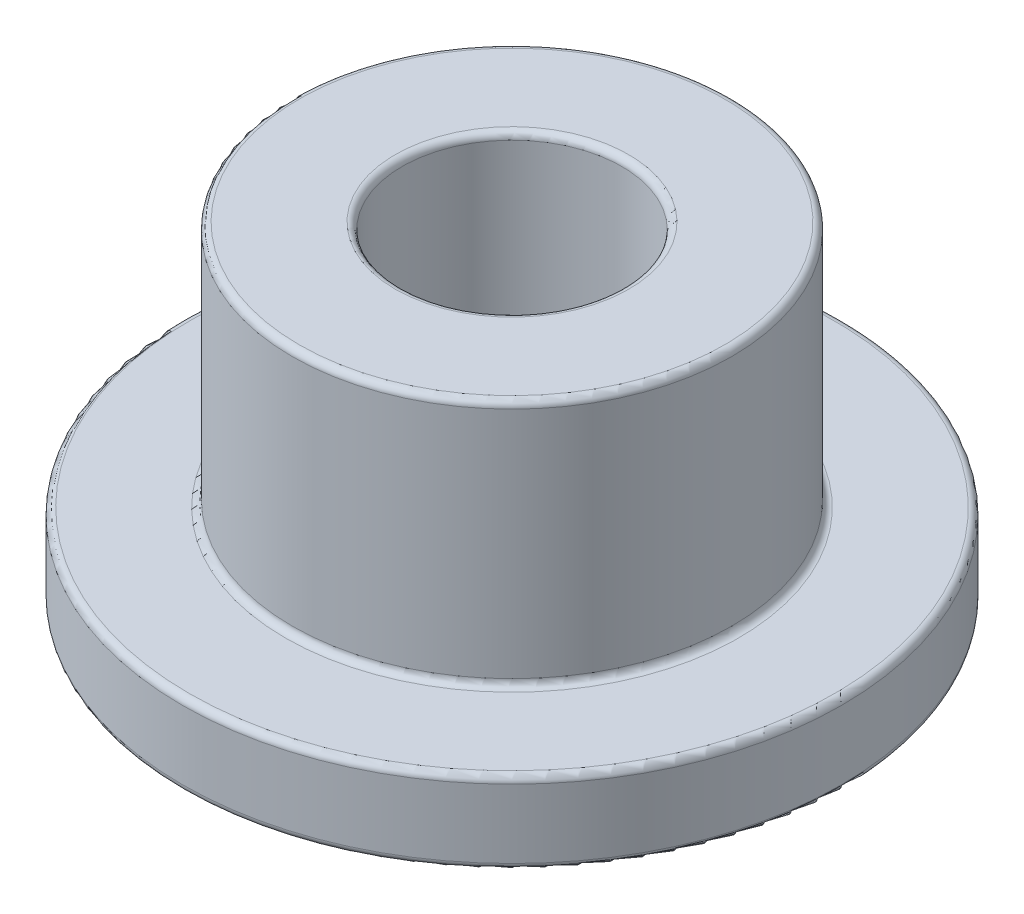
ISO-10303-21;
HEADER;
FILE_DESCRIPTION(('STEP AP214'),'2;1');
FILE_NAME('part.step','',(''),(''),'','','');
FILE_SCHEMA(('AUTOMOTIVE_DESIGN { 1 0 10303 214 1 1 1 1 }'));
ENDSEC;
DATA;
#1=APPLICATION_CONTEXT('core data for automotive mechanical design processes');
#2=APPLICATION_PROTOCOL_DEFINITION('international standard','automotive_design',2000,#1);
#3=PRODUCT_CONTEXT('',#1,'mechanical');
#4=PRODUCT('Part','Part','',(#3));
#5=PRODUCT_RELATED_PRODUCT_CATEGORY('part','',(#4));
#6=PRODUCT_DEFINITION_FORMATION('','',#4);
#7=PRODUCT_DEFINITION_CONTEXT('part definition',#1,'design');
#8=PRODUCT_DEFINITION('design','',#6,#7);
#9=PRODUCT_DEFINITION_SHAPE('','',#8);
#10=(LENGTH_UNIT() NAMED_UNIT(*) SI_UNIT(.MILLI.,.METRE.));
#11=(NAMED_UNIT(*) PLANE_ANGLE_UNIT() SI_UNIT($,.RADIAN.));
#12=(NAMED_UNIT(*) SI_UNIT($,.STERADIAN.) SOLID_ANGLE_UNIT());
#13=UNCERTAINTY_MEASURE_WITH_UNIT(LENGTH_MEASURE(1.E-05),#10,'distance_accuracy_value','');
#14=(GEOMETRIC_REPRESENTATION_CONTEXT(3) GLOBAL_UNCERTAINTY_ASSIGNED_CONTEXT((#13)) GLOBAL_UNIT_ASSIGNED_CONTEXT((#10,
#11,#12)) REPRESENTATION_CONTEXT('',''));
#15=CARTESIAN_POINT('',(0.,0.,0.));
#16=DIRECTION('',(0.,0.,1.));
#17=DIRECTION('',(1.,0.,0.));
#18=AXIS2_PLACEMENT_3D('',#15,#16,#17);
#19=CARTESIAN_POINT('',(0.,6.,0.));
#20=DIRECTION('',(0.,1.,0.));
#21=DIRECTION('',(0.,0.,1.));
#22=AXIS2_PLACEMENT_3D('',#19,#20,#21);
#23=PLANE('',#22);
#24=CARTESIAN_POINT('',(0.,6.,0.));
#25=DIRECTION('',(0.,1.,0.));
#26=DIRECTION('',(0.,0.,1.));
#27=AXIS2_PLACEMENT_3D('',#24,#25,#26);
#28=CIRCLE('',#27,2.125);
#29=CARTESIAN_POINT('',(0.,6.,2.125));
#30=VERTEX_POINT('',#29);
#31=EDGE_CURVE('E10',#30,#30,#28,.F.);
#32=ORIENTED_EDGE('',*,*,#31,.T.);
#33=EDGE_LOOP('',(#32));
#34=FACE_BOUND('',#33,.T.);
#35=CARTESIAN_POINT('',(0.,6.,0.));
#36=DIRECTION('',(0.,1.,0.));
#37=DIRECTION('',(0.,0.,1.));
#38=AXIS2_PLACEMENT_3D('',#35,#36,#37);
#39=CIRCLE('',#38,3.875);
#40=CARTESIAN_POINT('',(0.,6.,3.875));
#41=VERTEX_POINT('',#40);
#42=EDGE_CURVE('E51',#41,#41,#39,.T.);
#43=ORIENTED_EDGE('',*,*,#42,.T.);
#44=EDGE_LOOP('',(#43));
#45=FACE_BOUND('',#44,.T.);
#46=ADVANCED_FACE('F43',(#34,#45),#23,.T.);
#47=CARTESIAN_POINT('',(0.,0.,0.));
#48=DIRECTION('',(0.,1.,0.));
#49=DIRECTION('',(0.,0.,1.));
#50=AXIS2_PLACEMENT_3D('',#47,#48,#49);
#51=PLANE('',#50);
#52=CARTESIAN_POINT('',(0.,0.,0.));
#53=DIRECTION('',(0.,1.,0.));
#54=DIRECTION('',(0.,0.,1.));
#55=AXIS2_PLACEMENT_3D('',#52,#53,#54);
#56=CIRCLE('',#55,2.125);
#57=CARTESIAN_POINT('',(0.,0.,2.125));
#58=VERTEX_POINT('',#57);
#59=EDGE_CURVE('E91',#58,#58,#56,.T.);
#60=ORIENTED_EDGE('',*,*,#59,.T.);
#61=EDGE_LOOP('',(#60));
#62=FACE_BOUND('',#61,.T.);
#63=CARTESIAN_POINT('',(0.,0.,0.));
#64=DIRECTION('',(0.,1.,0.));
#65=DIRECTION('',(0.,0.,1.));
#66=AXIS2_PLACEMENT_3D('',#63,#64,#65);
#67=CIRCLE('',#66,5.875);
#68=CARTESIAN_POINT('',(0.,0.,5.875));
#69=VERTEX_POINT('',#68);
#70=EDGE_CURVE('E95',#69,#69,#67,.F.);
#71=ORIENTED_EDGE('',*,*,#70,.T.);
#72=EDGE_LOOP('',(#71));
#73=FACE_BOUND('',#72,.T.);
#74=ADVANCED_FACE('F100',(#62,#73),#51,.F.);
#75=CARTESIAN_POINT('',(0.,6.,0.));
#76=DIRECTION('',(0.,-1.,0.));
#77=DIRECTION('',(0.,0.,-1.));
#78=AXIS2_PLACEMENT_3D('',#75,#76,#77);
#79=CYLINDRICAL_SURFACE('',#78,4.);
#80=CARTESIAN_POINT('',(0.,1.625,0.));
#81=DIRECTION('',(0.,1.,0.));
#82=DIRECTION('',(0.,0.,1.));
#83=AXIS2_PLACEMENT_3D('',#80,#81,#82);
#84=CIRCLE('',#83,4.);
#85=CARTESIAN_POINT('',(0.,1.625,4.));
#86=VERTEX_POINT('',#85);
#87=EDGE_CURVE('E67',#86,#86,#84,.T.);
#88=ORIENTED_EDGE('',*,*,#87,.T.);
#89=EDGE_LOOP('',(#88));
#90=FACE_BOUND('',#89,.T.);
#91=CARTESIAN_POINT('',(0.,5.875,0.));
#92=DIRECTION('',(0.,1.,0.));
#93=DIRECTION('',(0.,0.,1.));
#94=AXIS2_PLACEMENT_3D('',#91,#92,#93);
#95=CIRCLE('',#94,4.);
#96=CARTESIAN_POINT('',(0.,5.875,4.));
#97=VERTEX_POINT('',#96);
#98=EDGE_CURVE('E71',#97,#97,#95,.F.);
#99=ORIENTED_EDGE('',*,*,#98,.T.);
#100=EDGE_LOOP('',(#99));
#101=FACE_BOUND('',#100,.T.);
#102=ADVANCED_FACE('F131',(#90,#101),#79,.T.);
#103=CARTESIAN_POINT('',(0.,6.,0.));
#104=DIRECTION('',(0.,-1.,0.));
#105=DIRECTION('',(0.,0.,-1.));
#106=AXIS2_PLACEMENT_3D('',#103,#104,#105);
#107=CYLINDRICAL_SURFACE('',#106,2.);
#108=CARTESIAN_POINT('',(0.,0.125,0.));
#109=DIRECTION('',(0.,1.,0.));
#110=DIRECTION('',(0.,0.,1.));
#111=AXIS2_PLACEMENT_3D('',#108,#109,#110);
#112=CIRCLE('',#111,2.);
#113=CARTESIAN_POINT('',(0.,0.125,2.));
#114=VERTEX_POINT('',#113);
#115=EDGE_CURVE('E83',#114,#114,#112,.F.);
#116=ORIENTED_EDGE('',*,*,#115,.T.);
#117=EDGE_LOOP('',(#116));
#118=FACE_BOUND('',#117,.T.);
#119=CARTESIAN_POINT('',(0.,5.875,0.));
#120=DIRECTION('',(0.,1.,0.));
#121=DIRECTION('',(0.,0.,1.));
#122=AXIS2_PLACEMENT_3D('',#119,#120,#121);
#123=CIRCLE('',#122,2.);
#124=CARTESIAN_POINT('',(0.,5.875,2.));
#125=VERTEX_POINT('',#124);
#126=EDGE_CURVE('E87',#125,#125,#123,.T.);
#127=ORIENTED_EDGE('',*,*,#126,.T.);
#128=EDGE_LOOP('',(#127));
#129=FACE_BOUND('',#128,.T.);
#130=ADVANCED_FACE('F125',(#118,#129),#107,.F.);
#131=CARTESIAN_POINT('',(0.,1.5,0.));
#132=DIRECTION('',(0.,1.,0.));
#133=DIRECTION('',(0.,0.,1.));
#134=AXIS2_PLACEMENT_3D('',#131,#132,#133);
#135=PLANE('',#134);
#136=CARTESIAN_POINT('',(0.,1.5,0.));
#137=DIRECTION('',(0.,1.,0.));
#138=DIRECTION('',(0.,0.,1.));
#139=AXIS2_PLACEMENT_3D('',#136,#137,#138);
#140=CIRCLE('',#139,4.125);
#141=CARTESIAN_POINT('',(0.,1.5,4.125));
#142=VERTEX_POINT('',#141);
#143=EDGE_CURVE('E56',#142,#142,#140,.F.);
#144=ORIENTED_EDGE('',*,*,#143,.T.);
#145=EDGE_LOOP('',(#144));
#146=FACE_BOUND('',#145,.T.);
#147=CARTESIAN_POINT('',(0.,1.5,0.));
#148=DIRECTION('',(0.,1.,0.));
#149=DIRECTION('',(0.,0.,1.));
#150=AXIS2_PLACEMENT_3D('',#147,#148,#149);
#151=CIRCLE('',#150,5.875);
#152=CARTESIAN_POINT('',(0.,1.5,5.875));
#153=VERTEX_POINT('',#152);
#154=EDGE_CURVE('E61',#153,#153,#151,.T.);
#155=ORIENTED_EDGE('',*,*,#154,.T.);
#156=EDGE_LOOP('',(#155));
#157=FACE_BOUND('',#156,.T.);
#158=ADVANCED_FACE('F113',(#146,#157),#135,.T.);
#159=CARTESIAN_POINT('',(0.,1.5,0.));
#160=DIRECTION('',(0.,-1.,0.));
#161=DIRECTION('',(0.,0.,-1.));
#162=AXIS2_PLACEMENT_3D('',#159,#160,#161);
#163=CYLINDRICAL_SURFACE('',#162,6.);
#164=CARTESIAN_POINT('',(0.,0.125,0.));
#165=DIRECTION('',(0.,1.,0.));
#166=DIRECTION('',(0.,0.,1.));
#167=AXIS2_PLACEMENT_3D('',#164,#165,#166);
#168=CIRCLE('',#167,6.);
#169=CARTESIAN_POINT('',(0.,0.125,6.));
#170=VERTEX_POINT('',#169);
#171=EDGE_CURVE('E75',#170,#170,#168,.T.);
#172=ORIENTED_EDGE('',*,*,#171,.T.);
#173=EDGE_LOOP('',(#172));
#174=FACE_BOUND('',#173,.T.);
#175=CARTESIAN_POINT('',(0.,1.375,0.));
#176=DIRECTION('',(0.,1.,0.));
#177=DIRECTION('',(0.,0.,1.));
#178=AXIS2_PLACEMENT_3D('',#175,#176,#177);
#179=CIRCLE('',#178,6.);
#180=CARTESIAN_POINT('',(0.,1.375,6.));
#181=VERTEX_POINT('',#180);
#182=EDGE_CURVE('E79',#181,#181,#179,.F.);
#183=ORIENTED_EDGE('',*,*,#182,.T.);
#184=EDGE_LOOP('',(#183));
#185=FACE_BOUND('',#184,.T.);
#186=ADVANCED_FACE('F110',(#174,#185),#163,.T.);
#187=CARTESIAN_POINT('',(0.,0.125,0.));
#188=DIRECTION('',(0.,1.,0.));
#189=DIRECTION('',(0.,0.,1.));
#190=AXIS2_PLACEMENT_3D('',#187,#188,#189);
#191=TOROIDAL_SURFACE('',#190,2.125,0.125);
#192=ORIENTED_EDGE('',*,*,#115,.F.);
#193=EDGE_LOOP('',(#192));
#194=FACE_BOUND('',#193,.T.);
#195=ORIENTED_EDGE('',*,*,#59,.F.);
#196=EDGE_LOOP('',(#195));
#197=FACE_BOUND('',#196,.T.);
#198=ADVANCED_FACE('F106',(#194,#197),#191,.T.);
#199=CARTESIAN_POINT('',(0.,0.125,0.));
#200=DIRECTION('',(0.,1.,0.));
#201=DIRECTION('',(0.,0.,1.));
#202=AXIS2_PLACEMENT_3D('',#199,#200,#201);
#203=TOROIDAL_SURFACE('',#202,5.875,0.125);
#204=ORIENTED_EDGE('',*,*,#70,.F.);
#205=EDGE_LOOP('',(#204));
#206=FACE_BOUND('',#205,.T.);
#207=ORIENTED_EDGE('',*,*,#171,.F.);
#208=EDGE_LOOP('',(#207));
#209=FACE_BOUND('',#208,.T.);
#210=ADVANCED_FACE('F102',(#206,#209),#203,.T.);
#211=CARTESIAN_POINT('',(0.,1.625,0.));
#212=DIRECTION('',(0.,1.,0.));
#213=DIRECTION('',(0.,0.,1.));
#214=AXIS2_PLACEMENT_3D('',#211,#212,#213);
#215=TOROIDAL_SURFACE('',#214,4.125,0.125);
#216=ORIENTED_EDGE('',*,*,#143,.F.);
#217=EDGE_LOOP('',(#216));
#218=FACE_BOUND('',#217,.T.);
#219=ORIENTED_EDGE('',*,*,#87,.F.);
#220=EDGE_LOOP('',(#219));
#221=FACE_BOUND('',#220,.T.);
#222=ADVANCED_FACE('F105',(#218,#221),#215,.F.);
#223=CARTESIAN_POINT('',(0.,1.375,0.));
#224=DIRECTION('',(0.,1.,0.));
#225=DIRECTION('',(0.,0.,1.));
#226=AXIS2_PLACEMENT_3D('',#223,#224,#225);
#227=TOROIDAL_SURFACE('',#226,5.875,0.125);
#228=ORIENTED_EDGE('',*,*,#182,.F.);
#229=EDGE_LOOP('',(#228));
#230=FACE_BOUND('',#229,.T.);
#231=ORIENTED_EDGE('',*,*,#154,.F.);
#232=EDGE_LOOP('',(#231));
#233=FACE_BOUND('',#232,.T.);
#234=ADVANCED_FACE('F117',(#230,#233),#227,.T.);
#235=CARTESIAN_POINT('',(0.,5.875,0.));
#236=DIRECTION('',(0.,1.,0.));
#237=DIRECTION('',(0.,0.,1.));
#238=AXIS2_PLACEMENT_3D('',#235,#236,#237);
#239=TOROIDAL_SURFACE('',#238,2.125,0.125);
#240=ORIENTED_EDGE('',*,*,#31,.F.);
#241=EDGE_LOOP('',(#240));
#242=FACE_BOUND('',#241,.T.);
#243=ORIENTED_EDGE('',*,*,#126,.F.);
#244=EDGE_LOOP('',(#243));
#245=FACE_BOUND('',#244,.T.);
#246=ADVANCED_FACE('F120',(#242,#245),#239,.T.);
#247=CARTESIAN_POINT('',(0.,5.875,0.));
#248=DIRECTION('',(0.,1.,0.));
#249=DIRECTION('',(0.,0.,1.));
#250=AXIS2_PLACEMENT_3D('',#247,#248,#249);
#251=TOROIDAL_SURFACE('',#250,3.875,0.125);
#252=ORIENTED_EDGE('',*,*,#98,.F.);
#253=EDGE_LOOP('',(#252));
#254=FACE_BOUND('',#253,.T.);
#255=ORIENTED_EDGE('',*,*,#42,.F.);
#256=EDGE_LOOP('',(#255));
#257=FACE_BOUND('',#256,.T.);
#258=ADVANCED_FACE('F45',(#254,#257),#251,.T.);
#259=CLOSED_SHELL('',(#46,#74,#102,#130,#158,#186,#198,#210,#222,#234,#246,#258));
#260=MANIFOLD_SOLID_BREP('B2',#259);
#261=ADVANCED_BREP_SHAPE_REPRESENTATION('',(#18,#260),#14);
#262=SHAPE_DEFINITION_REPRESENTATION(#9,#261);
ENDSEC;
END-ISO-10303-21;
